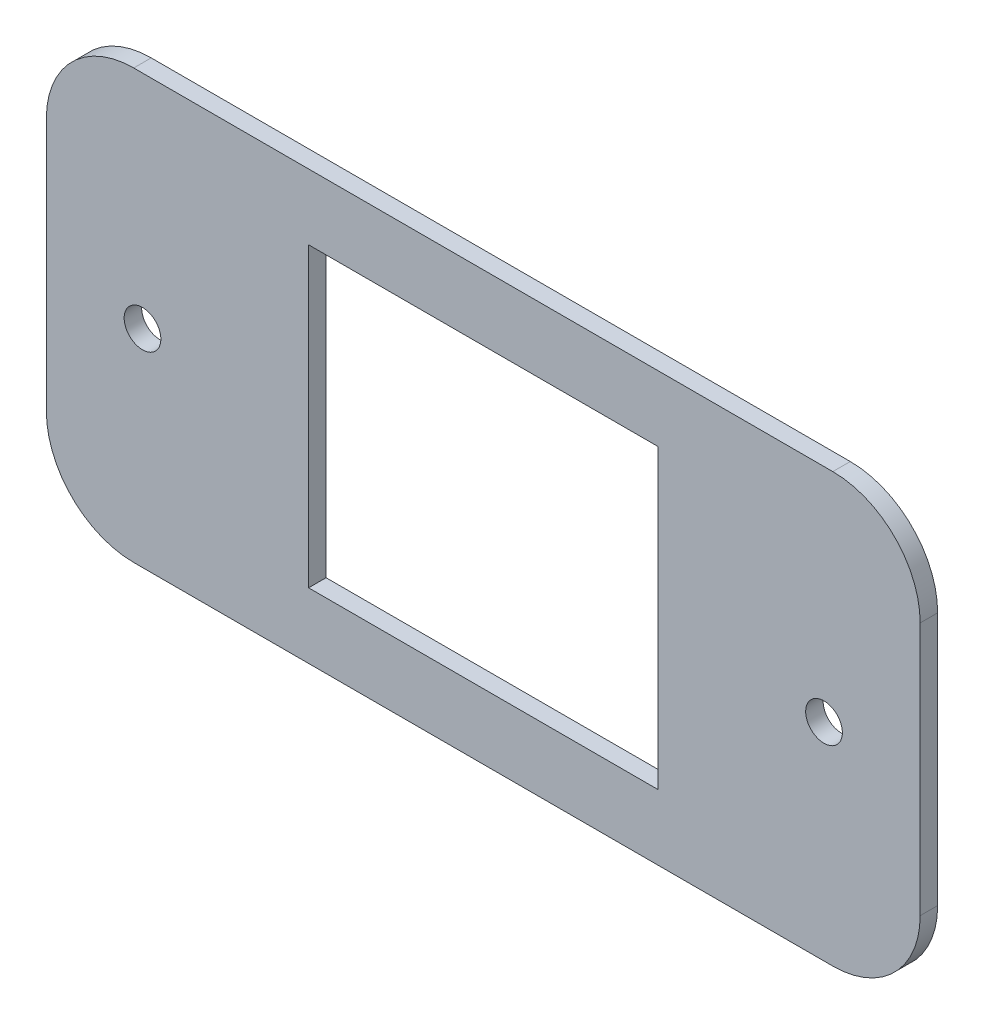
ISO-10303-21;
HEADER;
FILE_DESCRIPTION(('STEP AP214'),'2;1');
FILE_NAME('part.step','',(''),(''),'','','');
FILE_SCHEMA(('AUTOMOTIVE_DESIGN { 1 0 10303 214 1 1 1 1 }'));
ENDSEC;
DATA;
#1=APPLICATION_CONTEXT('core data for automotive mechanical design processes');
#2=APPLICATION_PROTOCOL_DEFINITION('international standard','automotive_design',2000,#1);
#3=PRODUCT_CONTEXT('',#1,'mechanical');
#4=PRODUCT('Part','Part','',(#3));
#5=PRODUCT_RELATED_PRODUCT_CATEGORY('part','',(#4));
#6=PRODUCT_DEFINITION_FORMATION('','',#4);
#7=PRODUCT_DEFINITION_CONTEXT('part definition',#1,'design');
#8=PRODUCT_DEFINITION('design','',#6,#7);
#9=PRODUCT_DEFINITION_SHAPE('','',#8);
#10=(LENGTH_UNIT() NAMED_UNIT(*) SI_UNIT(.MILLI.,.METRE.));
#11=(NAMED_UNIT(*) PLANE_ANGLE_UNIT() SI_UNIT($,.RADIAN.));
#12=(NAMED_UNIT(*) SI_UNIT($,.STERADIAN.) SOLID_ANGLE_UNIT());
#13=UNCERTAINTY_MEASURE_WITH_UNIT(LENGTH_MEASURE(1.E-05),#10,'distance_accuracy_value','');
#14=(GEOMETRIC_REPRESENTATION_CONTEXT(3) GLOBAL_UNCERTAINTY_ASSIGNED_CONTEXT((#13)) GLOBAL_UNIT_ASSIGNED_CONTEXT((#10,
#11,#12)) REPRESENTATION_CONTEXT('',''));
#15=CARTESIAN_POINT('',(0.,0.,0.));
#16=DIRECTION('',(0.,0.,1.));
#17=DIRECTION('',(1.,0.,0.));
#18=AXIS2_PLACEMENT_3D('',#15,#16,#17);
#19=CARTESIAN_POINT('',(-55.0062880101923,0.,2.));
#20=DIRECTION('',(-1.,0.,0.));
#21=DIRECTION('',(0.,0.,1.));
#22=AXIS2_PLACEMENT_3D('',#19,#20,#21);
#23=PLANE('',#22);
#24=DIRECTION('',(0.,1.,0.));
#25=VECTOR('',#24,1.);
#26=CARTESIAN_POINT('',(-55.0062880101923,0.,0.));
#27=LINE('',#26,#25);
#28=CARTESIAN_POINT('',(-55.0062880101923,-12.7036608596047,0.));
#29=VERTEX_POINT('',#28);
#30=CARTESIAN_POINT('',(-55.0062880101923,16.3118944314102,0.));
#31=VERTEX_POINT('',#30);
#32=EDGE_CURVE('E191',#29,#31,#27,.T.);
#33=ORIENTED_EDGE('',*,*,#32,.F.);
#34=DIRECTION('',(0.,0.,-1.));
#35=VECTOR('',#34,1.);
#36=CARTESIAN_POINT('',(-55.0062880101923,-12.7036608596047,2.));
#37=LINE('',#36,#35);
#38=CARTESIAN_POINT('',(-55.0062880101923,-12.7036608596047,2.));
#39=VERTEX_POINT('',#38);
#40=EDGE_CURVE('E221',#29,#39,#37,.F.);
#41=ORIENTED_EDGE('',*,*,#40,.T.);
#42=DIRECTION('',(0.,1.,0.));
#43=VECTOR('',#42,1.);
#44=CARTESIAN_POINT('',(-55.0062880101923,0.,2.));
#45=LINE('',#44,#43);
#46=CARTESIAN_POINT('',(-55.0062880101923,16.3118944314102,2.));
#47=VERTEX_POINT('',#46);
#48=EDGE_CURVE('E165',#39,#47,#45,.T.);
#49=ORIENTED_EDGE('',*,*,#48,.T.);
#50=DIRECTION('',(0.,0.,-1.));
#51=VECTOR('',#50,1.);
#52=CARTESIAN_POINT('',(-55.0062880101923,16.3118944314102,0.));
#53=LINE('',#52,#51);
#54=EDGE_CURVE('E218',#47,#31,#53,.T.);
#55=ORIENTED_EDGE('',*,*,#54,.T.);
#56=EDGE_LOOP('',(#33,#41,#49,#55));
#57=FACE_BOUND('',#56,.T.);
#58=ADVANCED_FACE('F41',(#57),#23,.T.);
#59=CARTESIAN_POINT('',(0.,-22.7036608596047,2.));
#60=DIRECTION('',(0.,-1.,0.));
#61=DIRECTION('',(0.,0.,-1.));
#62=AXIS2_PLACEMENT_3D('',#59,#60,#61);
#63=PLANE('',#62);
#64=DIRECTION('',(-1.,0.,0.));
#65=VECTOR('',#64,1.);
#66=CARTESIAN_POINT('',(0.,-22.7036608596047,2.));
#67=LINE('',#66,#65);
#68=CARTESIAN_POINT('',(35.0062880101924,-22.7036608596047,2.));
#69=VERTEX_POINT('',#68);
#70=CARTESIAN_POINT('',(-45.0062880101923,-22.7036608596047,2.));
#71=VERTEX_POINT('',#70);
#72=EDGE_CURVE('E168',#69,#71,#67,.T.);
#73=ORIENTED_EDGE('',*,*,#72,.T.);
#74=DIRECTION('',(0.,0.,-1.));
#75=VECTOR('',#74,1.);
#76=CARTESIAN_POINT('',(-45.0062880101923,-22.7036608596047,2.));
#77=LINE('',#76,#75);
#78=CARTESIAN_POINT('',(-45.0062880101923,-22.7036608596047,0.));
#79=VERTEX_POINT('',#78);
#80=EDGE_CURVE('E207',#71,#79,#77,.T.);
#81=ORIENTED_EDGE('',*,*,#80,.T.);
#82=DIRECTION('',(-1.,0.,0.));
#83=VECTOR('',#82,1.);
#84=CARTESIAN_POINT('',(0.,-22.7036608596047,0.));
#85=LINE('',#84,#83);
#86=CARTESIAN_POINT('',(35.0062880101924,-22.7036608596047,0.));
#87=VERTEX_POINT('',#86);
#88=EDGE_CURVE('E194',#87,#79,#85,.T.);
#89=ORIENTED_EDGE('',*,*,#88,.F.);
#90=DIRECTION('',(0.,0.,-1.));
#91=VECTOR('',#90,1.);
#92=CARTESIAN_POINT('',(35.0062880101924,-22.7036608596047,2.));
#93=LINE('',#92,#91);
#94=EDGE_CURVE('E142',#87,#69,#93,.F.);
#95=ORIENTED_EDGE('',*,*,#94,.T.);
#96=EDGE_LOOP('',(#73,#81,#89,#95));
#97=FACE_BOUND('',#96,.T.);
#98=ADVANCED_FACE('F263',(#97),#63,.T.);
#99=CARTESIAN_POINT('',(45.0062880101924,0.,2.));
#100=DIRECTION('',(-1.,0.,0.));
#101=DIRECTION('',(0.,-1.,0.));
#102=AXIS2_PLACEMENT_3D('',#99,#100,#101);
#103=PLANE('',#102);
#104=DIRECTION('',(0.,1.,0.));
#105=VECTOR('',#104,1.);
#106=CARTESIAN_POINT('',(45.0062880101924,0.,0.));
#107=LINE('',#106,#105);
#108=CARTESIAN_POINT('',(45.0062880101924,-12.7036608596047,0.));
#109=VERTEX_POINT('',#108);
#110=CARTESIAN_POINT('',(45.0062880101924,16.3118944314102,0.));
#111=VERTEX_POINT('',#110);
#112=EDGE_CURVE('E197',#109,#111,#107,.T.);
#113=ORIENTED_EDGE('',*,*,#112,.T.);
#114=DIRECTION('',(0.,0.,-1.));
#115=VECTOR('',#114,1.);
#116=CARTESIAN_POINT('',(45.0062880101924,16.3118944314102,2.));
#117=LINE('',#116,#115);
#118=CARTESIAN_POINT('',(45.0062880101924,16.3118944314102,2.));
#119=VERTEX_POINT('',#118);
#120=EDGE_CURVE('E11',#111,#119,#117,.F.);
#121=ORIENTED_EDGE('',*,*,#120,.T.);
#122=DIRECTION('',(0.,1.,0.));
#123=VECTOR('',#122,1.);
#124=CARTESIAN_POINT('',(45.0062880101924,0.,2.));
#125=LINE('',#124,#123);
#126=CARTESIAN_POINT('',(45.0062880101924,-12.7036608596047,2.));
#127=VERTEX_POINT('',#126);
#128=EDGE_CURVE('E171',#127,#119,#125,.T.);
#129=ORIENTED_EDGE('',*,*,#128,.F.);
#130=DIRECTION('',(0.,0.,-1.));
#131=VECTOR('',#130,1.);
#132=CARTESIAN_POINT('',(45.0062880101924,-12.7036608596047,0.));
#133=LINE('',#132,#131);
#134=EDGE_CURVE('E49',#127,#109,#133,.T.);
#135=ORIENTED_EDGE('',*,*,#134,.T.);
#136=EDGE_LOOP('',(#113,#121,#129,#135));
#137=FACE_BOUND('',#136,.T.);
#138=ADVANCED_FACE('F238',(#137),#103,.F.);
#139=CARTESIAN_POINT('',(0.,-15.2055960103487,2.));
#140=DIRECTION('',(0.,1.,0.));
#141=DIRECTION('',(0.,0.,1.));
#142=AXIS2_PLACEMENT_3D('',#139,#140,#141);
#143=PLANE('',#142);
#144=DIRECTION('',(1.,0.,0.));
#145=VECTOR('',#144,1.);
#146=CARTESIAN_POINT('',(0.,-15.2055960103487,0.));
#147=LINE('',#146,#145);
#148=CARTESIAN_POINT('',(-24.989859807856,-15.2055960103487,0.));
#149=VERTEX_POINT('',#148);
#150=CARTESIAN_POINT('',(15.0086820440752,-15.2055960103487,0.));
#151=VERTEX_POINT('',#150);
#152=EDGE_CURVE('E138',#149,#151,#147,.T.);
#153=ORIENTED_EDGE('',*,*,#152,.F.);
#154=DIRECTION('',(0.,0.,-1.));
#155=VECTOR('',#154,1.);
#156=CARTESIAN_POINT('',(-24.989859807856,-15.2055960103487,2.));
#157=LINE('',#156,#155);
#158=CARTESIAN_POINT('',(-24.989859807856,-15.2055960103487,2.));
#159=VERTEX_POINT('',#158);
#160=EDGE_CURVE('E131',#159,#149,#157,.T.);
#161=ORIENTED_EDGE('',*,*,#160,.F.);
#162=DIRECTION('',(1.,0.,0.));
#163=VECTOR('',#162,1.);
#164=CARTESIAN_POINT('',(0.,-15.2055960103487,2.));
#165=LINE('',#164,#163);
#166=CARTESIAN_POINT('',(15.0086820440752,-15.2055960103487,2.));
#167=VERTEX_POINT('',#166);
#168=EDGE_CURVE('E135',#159,#167,#165,.T.);
#169=ORIENTED_EDGE('',*,*,#168,.T.);
#170=DIRECTION('',(0.,0.,-1.));
#171=VECTOR('',#170,1.);
#172=CARTESIAN_POINT('',(15.0086820440752,-15.2055960103487,2.));
#173=LINE('',#172,#171);
#174=EDGE_CURVE('E175',#167,#151,#173,.T.);
#175=ORIENTED_EDGE('',*,*,#174,.T.);
#176=EDGE_LOOP('',(#153,#161,#169,#175));
#177=FACE_BOUND('',#176,.T.);
#178=ADVANCED_FACE('F133',(#177),#143,.T.);
#179=CARTESIAN_POINT('',(-24.989859807856,0.,2.));
#180=DIRECTION('',(-1.,0.,0.));
#181=DIRECTION('',(0.,0.,1.));
#182=AXIS2_PLACEMENT_3D('',#179,#180,#181);
#183=PLANE('',#182);
#184=DIRECTION('',(0.,1.,0.));
#185=VECTOR('',#184,1.);
#186=CARTESIAN_POINT('',(-24.989859807856,0.,0.));
#187=LINE('',#186,#185);
#188=CARTESIAN_POINT('',(-24.989859807856,18.7954825745892,0.));
#189=VERTEX_POINT('',#188);
#190=EDGE_CURVE('E183',#149,#189,#187,.T.);
#191=ORIENTED_EDGE('',*,*,#190,.T.);
#192=DIRECTION('',(0.,0.,-1.));
#193=VECTOR('',#192,1.);
#194=CARTESIAN_POINT('',(-24.989859807856,18.7954825745892,2.));
#195=LINE('',#194,#193);
#196=CARTESIAN_POINT('',(-24.989859807856,18.7954825745892,2.));
#197=VERTEX_POINT('',#196);
#198=EDGE_CURVE('E143',#197,#189,#195,.T.);
#199=ORIENTED_EDGE('',*,*,#198,.F.);
#200=DIRECTION('',(0.,1.,0.));
#201=VECTOR('',#200,1.);
#202=CARTESIAN_POINT('',(-24.989859807856,0.,2.));
#203=LINE('',#202,#201);
#204=EDGE_CURVE('E147',#159,#197,#203,.T.);
#205=ORIENTED_EDGE('',*,*,#204,.F.);
#206=ORIENTED_EDGE('',*,*,#160,.T.);
#207=EDGE_LOOP('',(#191,#199,#205,#206));
#208=FACE_BOUND('',#207,.T.);
#209=ADVANCED_FACE('F148',(#208),#183,.F.);
#210=CARTESIAN_POINT('',(0.,18.7954825745892,2.));
#211=DIRECTION('',(0.,1.,0.));
#212=DIRECTION('',(0.,0.,1.));
#213=AXIS2_PLACEMENT_3D('',#210,#211,#212);
#214=PLANE('',#213);
#215=DIRECTION('',(1.,0.,0.));
#216=VECTOR('',#215,1.);
#217=CARTESIAN_POINT('',(0.,18.7954825745892,0.));
#218=LINE('',#217,#216);
#219=CARTESIAN_POINT('',(15.0086820440752,18.7954825745892,0.));
#220=VERTEX_POINT('',#219);
#221=EDGE_CURVE('E185',#189,#220,#218,.T.);
#222=ORIENTED_EDGE('',*,*,#221,.T.);
#223=DIRECTION('',(0.,0.,-1.));
#224=VECTOR('',#223,1.);
#225=CARTESIAN_POINT('',(15.0086820440752,18.7954825745892,2.));
#226=LINE('',#225,#224);
#227=CARTESIAN_POINT('',(15.0086820440752,18.7954825745892,2.));
#228=VERTEX_POINT('',#227);
#229=EDGE_CURVE('E203',#228,#220,#226,.T.);
#230=ORIENTED_EDGE('',*,*,#229,.F.);
#231=DIRECTION('',(1.,0.,0.));
#232=VECTOR('',#231,1.);
#233=CARTESIAN_POINT('',(0.,18.7954825745892,2.));
#234=LINE('',#233,#232);
#235=EDGE_CURVE('E151',#197,#228,#234,.T.);
#236=ORIENTED_EDGE('',*,*,#235,.F.);
#237=ORIENTED_EDGE('',*,*,#198,.T.);
#238=EDGE_LOOP('',(#222,#230,#236,#237));
#239=FACE_BOUND('',#238,.T.);
#240=ADVANCED_FACE('F283',(#239),#214,.F.);
#241=CARTESIAN_POINT('',(15.0086820440752,0.,2.));
#242=DIRECTION('',(-1.,0.,0.));
#243=DIRECTION('',(0.,-1.,0.));
#244=AXIS2_PLACEMENT_3D('',#241,#242,#243);
#245=PLANE('',#244);
#246=DIRECTION('',(0.,1.,0.));
#247=VECTOR('',#246,1.);
#248=CARTESIAN_POINT('',(15.0086820440752,0.,0.));
#249=LINE('',#248,#247);
#250=EDGE_CURVE('E188',#151,#220,#249,.T.);
#251=ORIENTED_EDGE('',*,*,#250,.F.);
#252=ORIENTED_EDGE('',*,*,#174,.F.);
#253=DIRECTION('',(0.,1.,0.));
#254=VECTOR('',#253,1.);
#255=CARTESIAN_POINT('',(15.0086820440752,0.,2.));
#256=LINE('',#255,#254);
#257=EDGE_CURVE('E155',#167,#228,#256,.T.);
#258=ORIENTED_EDGE('',*,*,#257,.T.);
#259=ORIENTED_EDGE('',*,*,#229,.T.);
#260=EDGE_LOOP('',(#251,#252,#258,#259));
#261=FACE_BOUND('',#260,.T.);
#262=ADVANCED_FACE('F279',(#261),#245,.T.);
#263=CARTESIAN_POINT('',(-44.,0.981727340360138,2.));
#264=DIRECTION('',(0.,0.,-1.));
#265=DIRECTION('',(-1.,0.,0.));
#266=AXIS2_PLACEMENT_3D('',#263,#264,#265);
#267=CYLINDRICAL_SURFACE('',#266,2.1);
#268=CARTESIAN_POINT('',(-44.,0.981727340360138,2.));
#269=DIRECTION('',(0.,0.,1.));
#270=DIRECTION('',(1.,0.,0.));
#271=AXIS2_PLACEMENT_3D('',#268,#269,#270);
#272=CIRCLE('',#271,2.1);
#273=CARTESIAN_POINT('',(-41.9,0.981727340360138,2.));
#274=VERTEX_POINT('',#273);
#275=EDGE_CURVE('E156',#274,#274,#272,.T.);
#276=ORIENTED_EDGE('',*,*,#275,.T.);
#277=EDGE_LOOP('',(#276));
#278=FACE_BOUND('',#277,.T.);
#279=CARTESIAN_POINT('',(-44.,0.981727340360138,0.));
#280=DIRECTION('',(0.,0.,1.));
#281=DIRECTION('',(1.,0.,0.));
#282=AXIS2_PLACEMENT_3D('',#279,#280,#281);
#283=CIRCLE('',#282,2.1);
#284=CARTESIAN_POINT('',(-41.9,0.981727340360138,0.));
#285=VERTEX_POINT('',#284);
#286=EDGE_CURVE('E179',#285,#285,#283,.T.);
#287=ORIENTED_EDGE('',*,*,#286,.F.);
#288=EDGE_LOOP('',(#287));
#289=FACE_BOUND('',#288,.T.);
#290=ADVANCED_FACE('F282',(#278,#289),#267,.F.);
#291=CARTESIAN_POINT('',(34.,0.981727340360127,2.));
#292=DIRECTION('',(0.,0.,-1.));
#293=DIRECTION('',(-1.,0.,0.));
#294=AXIS2_PLACEMENT_3D('',#291,#292,#293);
#295=CYLINDRICAL_SURFACE('',#294,2.1);
#296=CARTESIAN_POINT('',(34.,0.981727340360127,2.));
#297=DIRECTION('',(0.,0.,1.));
#298=DIRECTION('',(1.,0.,0.));
#299=AXIS2_PLACEMENT_3D('',#296,#297,#298);
#300=CIRCLE('',#299,2.1);
#301=CARTESIAN_POINT('',(36.1,0.981727340360127,2.));
#302=VERTEX_POINT('',#301);
#303=EDGE_CURVE('E159',#302,#302,#300,.T.);
#304=ORIENTED_EDGE('',*,*,#303,.T.);
#305=EDGE_LOOP('',(#304));
#306=FACE_BOUND('',#305,.T.);
#307=CARTESIAN_POINT('',(34.,0.981727340360127,0.));
#308=DIRECTION('',(0.,0.,1.));
#309=DIRECTION('',(1.,0.,0.));
#310=AXIS2_PLACEMENT_3D('',#307,#308,#309);
#311=CIRCLE('',#310,2.1);
#312=CARTESIAN_POINT('',(36.1,0.981727340360127,0.));
#313=VERTEX_POINT('',#312);
#314=EDGE_CURVE('E176',#313,#313,#311,.T.);
#315=ORIENTED_EDGE('',*,*,#314,.F.);
#316=EDGE_LOOP('',(#315));
#317=FACE_BOUND('',#316,.T.);
#318=ADVANCED_FACE('F294',(#306,#317),#295,.F.);
#319=CARTESIAN_POINT('',(0.,26.3118944314102,2.));
#320=DIRECTION('',(0.,-1.,0.));
#321=DIRECTION('',(0.,0.,-1.));
#322=AXIS2_PLACEMENT_3D('',#319,#320,#321);
#323=PLANE('',#322);
#324=DIRECTION('',(-1.,0.,0.));
#325=VECTOR('',#324,1.);
#326=CARTESIAN_POINT('',(0.,26.3118944314102,0.));
#327=LINE('',#326,#325);
#328=CARTESIAN_POINT('',(35.0062880101924,26.3118944314102,0.));
#329=VERTEX_POINT('',#328);
#330=CARTESIAN_POINT('',(-45.0062880101923,26.3118944314102,0.));
#331=VERTEX_POINT('',#330);
#332=EDGE_CURVE('E200',#329,#331,#327,.T.);
#333=ORIENTED_EDGE('',*,*,#332,.T.);
#334=DIRECTION('',(0.,0.,-1.));
#335=VECTOR('',#334,1.);
#336=CARTESIAN_POINT('',(-45.0062880101923,26.3118944314102,2.));
#337=LINE('',#336,#335);
#338=CARTESIAN_POINT('',(-45.0062880101923,26.3118944314102,2.));
#339=VERTEX_POINT('',#338);
#340=EDGE_CURVE('E56',#331,#339,#337,.F.);
#341=ORIENTED_EDGE('',*,*,#340,.T.);
#342=DIRECTION('',(-1.,0.,0.));
#343=VECTOR('',#342,1.);
#344=CARTESIAN_POINT('',(0.,26.3118944314102,2.));
#345=LINE('',#344,#343);
#346=CARTESIAN_POINT('',(35.0062880101924,26.3118944314102,2.));
#347=VERTEX_POINT('',#346);
#348=EDGE_CURVE('E173',#347,#339,#345,.T.);
#349=ORIENTED_EDGE('',*,*,#348,.F.);
#350=DIRECTION('',(0.,0.,-1.));
#351=VECTOR('',#350,1.);
#352=CARTESIAN_POINT('',(35.0062880101924,26.3118944314102,2.));
#353=LINE('',#352,#351);
#354=EDGE_CURVE('E230',#347,#329,#353,.T.);
#355=ORIENTED_EDGE('',*,*,#354,.T.);
#356=EDGE_LOOP('',(#333,#341,#349,#355));
#357=FACE_BOUND('',#356,.T.);
#358=ADVANCED_FACE('F249',(#357),#323,.F.);
#359=CARTESIAN_POINT('',(0.,0.,2.));
#360=DIRECTION('',(0.,0.,1.));
#361=DIRECTION('',(1.,0.,0.));
#362=AXIS2_PLACEMENT_3D('',#359,#360,#361);
#363=PLANE('',#362);
#364=ORIENTED_EDGE('',*,*,#303,.F.);
#365=EDGE_LOOP('',(#364));
#366=FACE_BOUND('',#365,.T.);
#367=ORIENTED_EDGE('',*,*,#275,.F.);
#368=EDGE_LOOP('',(#367));
#369=FACE_BOUND('',#368,.T.);
#370=ORIENTED_EDGE('',*,*,#168,.F.);
#371=ORIENTED_EDGE('',*,*,#204,.T.);
#372=ORIENTED_EDGE('',*,*,#235,.T.);
#373=ORIENTED_EDGE('',*,*,#257,.F.);
#374=EDGE_LOOP('',(#370,#371,#372,#373));
#375=FACE_BOUND('',#374,.T.);
#376=ORIENTED_EDGE('',*,*,#48,.F.);
#377=CARTESIAN_POINT('',(-45.0062880101923,-12.7036608596047,2.));
#378=DIRECTION('',(0.,0.,1.));
#379=DIRECTION('',(1.,0.,0.));
#380=AXIS2_PLACEMENT_3D('',#377,#378,#379);
#381=CIRCLE('',#380,10.);
#382=EDGE_CURVE('E228',#39,#71,#381,.T.);
#383=ORIENTED_EDGE('',*,*,#382,.T.);
#384=ORIENTED_EDGE('',*,*,#72,.F.);
#385=CARTESIAN_POINT('',(35.0062880101924,-12.7036608596047,2.));
#386=DIRECTION('',(0.,0.,1.));
#387=DIRECTION('',(1.,0.,0.));
#388=AXIS2_PLACEMENT_3D('',#385,#386,#387);
#389=CIRCLE('',#388,10.);
#390=EDGE_CURVE('E223',#69,#127,#389,.T.);
#391=ORIENTED_EDGE('',*,*,#390,.T.);
#392=ORIENTED_EDGE('',*,*,#128,.T.);
#393=CARTESIAN_POINT('',(35.0062880101924,16.3118944314102,2.));
#394=DIRECTION('',(0.,0.,1.));
#395=DIRECTION('',(1.,0.,0.));
#396=AXIS2_PLACEMENT_3D('',#393,#394,#395);
#397=CIRCLE('',#396,10.);
#398=EDGE_CURVE('E63',#119,#347,#397,.T.);
#399=ORIENTED_EDGE('',*,*,#398,.T.);
#400=ORIENTED_EDGE('',*,*,#348,.T.);
#401=CARTESIAN_POINT('',(-45.0062880101923,16.3118944314102,2.));
#402=DIRECTION('',(0.,0.,1.));
#403=DIRECTION('',(1.,0.,0.));
#404=AXIS2_PLACEMENT_3D('',#401,#402,#403);
#405=CIRCLE('',#404,10.);
#406=EDGE_CURVE('E226',#339,#47,#405,.T.);
#407=ORIENTED_EDGE('',*,*,#406,.T.);
#408=EDGE_LOOP('',(#376,#383,#384,#391,#392,#399,#400,#407));
#409=FACE_BOUND('',#408,.T.);
#410=ADVANCED_FACE('F153',(#366,#369,#375,#409),#363,.T.);
#411=CARTESIAN_POINT('',(0.,0.,0.));
#412=DIRECTION('',(0.,0.,1.));
#413=DIRECTION('',(1.,0.,0.));
#414=AXIS2_PLACEMENT_3D('',#411,#412,#413);
#415=PLANE('',#414);
#416=ORIENTED_EDGE('',*,*,#314,.T.);
#417=EDGE_LOOP('',(#416));
#418=FACE_BOUND('',#417,.T.);
#419=ORIENTED_EDGE('',*,*,#286,.T.);
#420=EDGE_LOOP('',(#419));
#421=FACE_BOUND('',#420,.T.);
#422=ORIENTED_EDGE('',*,*,#152,.T.);
#423=ORIENTED_EDGE('',*,*,#250,.T.);
#424=ORIENTED_EDGE('',*,*,#221,.F.);
#425=ORIENTED_EDGE('',*,*,#190,.F.);
#426=EDGE_LOOP('',(#422,#423,#424,#425));
#427=FACE_BOUND('',#426,.T.);
#428=ORIENTED_EDGE('',*,*,#88,.T.);
#429=CARTESIAN_POINT('',(-45.0062880101923,-12.7036608596047,0.));
#430=DIRECTION('',(0.,0.,1.));
#431=DIRECTION('',(1.,0.,0.));
#432=AXIS2_PLACEMENT_3D('',#429,#430,#431);
#433=CIRCLE('',#432,10.);
#434=EDGE_CURVE('E216',#79,#29,#433,.F.);
#435=ORIENTED_EDGE('',*,*,#434,.T.);
#436=ORIENTED_EDGE('',*,*,#32,.T.);
#437=CARTESIAN_POINT('',(-45.0062880101923,16.3118944314102,0.));
#438=DIRECTION('',(0.,0.,1.));
#439=DIRECTION('',(1.,0.,0.));
#440=AXIS2_PLACEMENT_3D('',#437,#438,#439);
#441=CIRCLE('',#440,10.);
#442=EDGE_CURVE('E214',#31,#331,#441,.F.);
#443=ORIENTED_EDGE('',*,*,#442,.T.);
#444=ORIENTED_EDGE('',*,*,#332,.F.);
#445=CARTESIAN_POINT('',(35.0062880101924,16.3118944314102,0.));
#446=DIRECTION('',(0.,0.,1.));
#447=DIRECTION('',(1.,0.,0.));
#448=AXIS2_PLACEMENT_3D('',#445,#446,#447);
#449=CIRCLE('',#448,10.);
#450=EDGE_CURVE('E212',#329,#111,#449,.F.);
#451=ORIENTED_EDGE('',*,*,#450,.T.);
#452=ORIENTED_EDGE('',*,*,#112,.F.);
#453=CARTESIAN_POINT('',(35.0062880101924,-12.7036608596047,0.));
#454=DIRECTION('',(0.,0.,1.));
#455=DIRECTION('',(1.,0.,0.));
#456=AXIS2_PLACEMENT_3D('',#453,#454,#455);
#457=CIRCLE('',#456,10.);
#458=EDGE_CURVE('E210',#109,#87,#457,.F.);
#459=ORIENTED_EDGE('',*,*,#458,.T.);
#460=EDGE_LOOP('',(#428,#435,#436,#443,#444,#451,#452,#459));
#461=FACE_BOUND('',#460,.T.);
#462=ADVANCED_FACE('F243',(#418,#421,#427,#461),#415,.F.);
#463=CARTESIAN_POINT('',(-45.0062880101923,-12.7036608596047,2.));
#464=DIRECTION('',(0.,0.,-1.));
#465=DIRECTION('',(-1.,0.,0.));
#466=AXIS2_PLACEMENT_3D('',#463,#464,#465);
#467=CYLINDRICAL_SURFACE('',#466,10.);
#468=ORIENTED_EDGE('',*,*,#382,.F.);
#469=ORIENTED_EDGE('',*,*,#40,.F.);
#470=ORIENTED_EDGE('',*,*,#434,.F.);
#471=ORIENTED_EDGE('',*,*,#80,.F.);
#472=EDGE_LOOP('',(#468,#469,#470,#471));
#473=FACE_BOUND('',#472,.T.);
#474=ADVANCED_FACE('F261',(#473),#467,.T.);
#475=CARTESIAN_POINT('',(-45.0062880101923,16.3118944314102,2.));
#476=DIRECTION('',(0.,0.,1.));
#477=DIRECTION('',(1.,0.,0.));
#478=AXIS2_PLACEMENT_3D('',#475,#476,#477);
#479=CYLINDRICAL_SURFACE('',#478,10.);
#480=ORIENTED_EDGE('',*,*,#406,.F.);
#481=ORIENTED_EDGE('',*,*,#340,.F.);
#482=ORIENTED_EDGE('',*,*,#442,.F.);
#483=ORIENTED_EDGE('',*,*,#54,.F.);
#484=EDGE_LOOP('',(#480,#481,#482,#483));
#485=FACE_BOUND('',#484,.T.);
#486=ADVANCED_FACE('F254',(#485),#479,.T.);
#487=CARTESIAN_POINT('',(35.0062880101924,16.3118944314102,2.));
#488=DIRECTION('',(0.,0.,-1.));
#489=DIRECTION('',(-1.,0.,0.));
#490=AXIS2_PLACEMENT_3D('',#487,#488,#489);
#491=CYLINDRICAL_SURFACE('',#490,10.);
#492=ORIENTED_EDGE('',*,*,#398,.F.);
#493=ORIENTED_EDGE('',*,*,#120,.F.);
#494=ORIENTED_EDGE('',*,*,#450,.F.);
#495=ORIENTED_EDGE('',*,*,#354,.F.);
#496=EDGE_LOOP('',(#492,#493,#494,#495));
#497=FACE_BOUND('',#496,.T.);
#498=ADVANCED_FACE('F248',(#497),#491,.T.);
#499=CARTESIAN_POINT('',(35.0062880101924,-12.7036608596047,2.));
#500=DIRECTION('',(0.,0.,1.));
#501=DIRECTION('',(1.,0.,0.));
#502=AXIS2_PLACEMENT_3D('',#499,#500,#501);
#503=CYLINDRICAL_SURFACE('',#502,10.);
#504=ORIENTED_EDGE('',*,*,#390,.F.);
#505=ORIENTED_EDGE('',*,*,#94,.F.);
#506=ORIENTED_EDGE('',*,*,#458,.F.);
#507=ORIENTED_EDGE('',*,*,#134,.F.);
#508=EDGE_LOOP('',(#504,#505,#506,#507));
#509=FACE_BOUND('',#508,.T.);
#510=ADVANCED_FACE('F43',(#509),#503,.T.);
#511=CLOSED_SHELL('',(#58,#98,#138,#178,#209,#240,#262,#290,#318,#358,#410,#462,#474,#486,#498,#510));
#512=MANIFOLD_SOLID_BREP('B2',#511);
#513=ADVANCED_BREP_SHAPE_REPRESENTATION('',(#18,#512),#14);
#514=SHAPE_DEFINITION_REPRESENTATION(#9,#513);
ENDSEC;
END-ISO-10303-21;
